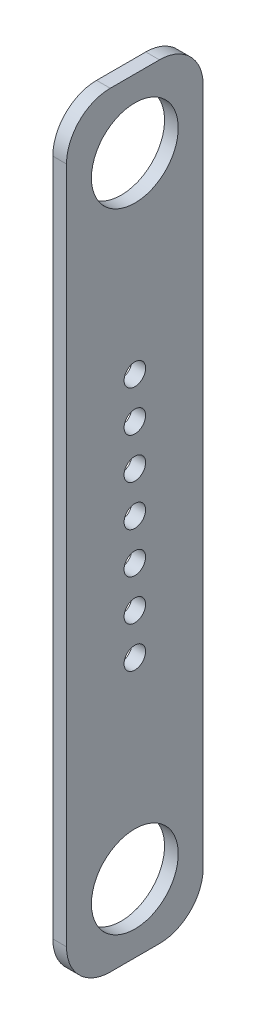
ISO-10303-21;
HEADER;
FILE_DESCRIPTION(('STEP AP214'),'2;1');
FILE_NAME('part.step','',(''),(''),'','','');
FILE_SCHEMA(('AUTOMOTIVE_DESIGN { 1 0 10303 214 1 1 1 1 }'));
ENDSEC;
DATA;
#1=APPLICATION_CONTEXT('core data for automotive mechanical design processes');
#2=APPLICATION_PROTOCOL_DEFINITION('international standard','automotive_design',2000,#1);
#3=PRODUCT_CONTEXT('',#1,'mechanical');
#4=PRODUCT('Part','Part','',(#3));
#5=PRODUCT_RELATED_PRODUCT_CATEGORY('part','',(#4));
#6=PRODUCT_DEFINITION_FORMATION('','',#4);
#7=PRODUCT_DEFINITION_CONTEXT('part definition',#1,'design');
#8=PRODUCT_DEFINITION('design','',#6,#7);
#9=PRODUCT_DEFINITION_SHAPE('','',#8);
#10=(LENGTH_UNIT() NAMED_UNIT(*) SI_UNIT(.MILLI.,.METRE.));
#11=(NAMED_UNIT(*) PLANE_ANGLE_UNIT() SI_UNIT($,.RADIAN.));
#12=(NAMED_UNIT(*) SI_UNIT($,.STERADIAN.) SOLID_ANGLE_UNIT());
#13=UNCERTAINTY_MEASURE_WITH_UNIT(LENGTH_MEASURE(1.E-05),#10,'distance_accuracy_value','');
#14=(GEOMETRIC_REPRESENTATION_CONTEXT(3) GLOBAL_UNCERTAINTY_ASSIGNED_CONTEXT((#13)) GLOBAL_UNIT_ASSIGNED_CONTEXT((#10,
#11,#12)) REPRESENTATION_CONTEXT('',''));
#15=CARTESIAN_POINT('',(0.,0.,0.));
#16=DIRECTION('',(0.,0.,1.));
#17=DIRECTION('',(1.,0.,0.));
#18=AXIS2_PLACEMENT_3D('',#15,#16,#17);
#19=CARTESIAN_POINT('',(0.,0.,0.));
#20=DIRECTION('',(1.,0.,0.));
#21=DIRECTION('',(0.,0.,-1.));
#22=AXIS2_PLACEMENT_3D('',#19,#20,#21);
#23=PLANE('',#22);
#24=CARTESIAN_POINT('',(0.,36.5125,0.));
#25=DIRECTION('',(-1.,0.,0.));
#26=DIRECTION('',(0.,0.,1.));
#27=AXIS2_PLACEMENT_3D('',#24,#25,#26);
#28=CIRCLE('',#27,5.0419);
#29=CARTESIAN_POINT('',(0.,36.5125,5.0419));
#30=VERTEX_POINT('',#29);
#31=EDGE_CURVE('E226',#30,#30,#28,.T.);
#32=ORIENTED_EDGE('',*,*,#31,.T.);
#33=EDGE_LOOP('',(#32));
#34=FACE_BOUND('',#33,.T.);
#35=CARTESIAN_POINT('',(0.,-14.250000075,0.));
#36=DIRECTION('',(-1.,0.,0.));
#37=DIRECTION('',(0.,0.,1.));
#38=AXIS2_PLACEMENT_3D('',#35,#36,#37);
#39=CIRCLE('',#38,1.25);
#40=CARTESIAN_POINT('',(0.,-14.250000075,1.25));
#41=VERTEX_POINT('',#40);
#42=EDGE_CURVE('E214',#41,#41,#39,.T.);
#43=ORIENTED_EDGE('',*,*,#42,.T.);
#44=EDGE_LOOP('',(#43));
#45=FACE_BOUND('',#44,.T.);
#46=DIRECTION('',(0.,0.,1.));
#47=VECTOR('',#46,1.);
#48=CARTESIAN_POINT('',(0.,44.45,-7.93749999999999));
#49=LINE('',#48,#47);
#50=CARTESIAN_POINT('',(0.,44.45,-2.8575));
#51=VERTEX_POINT('',#50);
#52=CARTESIAN_POINT('',(0.,44.45,2.8575));
#53=VERTEX_POINT('',#52);
#54=EDGE_CURVE('E112',#51,#53,#49,.T.);
#55=ORIENTED_EDGE('',*,*,#54,.T.);
#56=CARTESIAN_POINT('',(0.,39.37,2.8575));
#57=DIRECTION('',(1.,0.,0.));
#58=DIRECTION('',(0.,0.,-1.));
#59=AXIS2_PLACEMENT_3D('',#56,#57,#58);
#60=CIRCLE('',#59,5.08);
#61=CARTESIAN_POINT('',(0.,39.37,7.93750000000001));
#62=VERTEX_POINT('',#61);
#63=EDGE_CURVE('E118',#53,#62,#60,.T.);
#64=ORIENTED_EDGE('',*,*,#63,.T.);
#65=DIRECTION('',(0.,-1.,0.));
#66=VECTOR('',#65,1.);
#67=CARTESIAN_POINT('',(0.,44.45,7.93750000000001));
#68=LINE('',#67,#66);
#69=CARTESIAN_POINT('',(0.,-39.37,7.93749999999999));
#70=VERTEX_POINT('',#69);
#71=EDGE_CURVE('E128',#62,#70,#68,.T.);
#72=ORIENTED_EDGE('',*,*,#71,.T.);
#73=CARTESIAN_POINT('',(0.,-39.37,2.8575));
#74=DIRECTION('',(1.,0.,0.));
#75=DIRECTION('',(0.,0.,-1.));
#76=AXIS2_PLACEMENT_3D('',#73,#74,#75);
#77=CIRCLE('',#76,5.08);
#78=CARTESIAN_POINT('',(0.,-44.45,2.8575));
#79=VERTEX_POINT('',#78);
#80=EDGE_CURVE('E119',#70,#79,#77,.T.);
#81=ORIENTED_EDGE('',*,*,#80,.T.);
#82=DIRECTION('',(0.,0.,-1.));
#83=VECTOR('',#82,1.);
#84=CARTESIAN_POINT('',(0.,-44.45,-7.9375));
#85=LINE('',#84,#83);
#86=CARTESIAN_POINT('',(0.,-44.45,-2.8575));
#87=VERTEX_POINT('',#86);
#88=EDGE_CURVE('E164',#79,#87,#85,.T.);
#89=ORIENTED_EDGE('',*,*,#88,.T.);
#90=CARTESIAN_POINT('',(0.,-39.37,-2.8575));
#91=DIRECTION('',(1.,0.,0.));
#92=DIRECTION('',(0.,0.,-1.));
#93=AXIS2_PLACEMENT_3D('',#90,#91,#92);
#94=CIRCLE('',#93,5.08);
#95=CARTESIAN_POINT('',(0.,-39.37,-7.9375));
#96=VERTEX_POINT('',#95);
#97=EDGE_CURVE('E133',#87,#96,#94,.T.);
#98=ORIENTED_EDGE('',*,*,#97,.T.);
#99=DIRECTION('',(0.,1.,0.));
#100=VECTOR('',#99,1.);
#101=CARTESIAN_POINT('',(0.,44.45,-7.93749999999999));
#102=LINE('',#101,#100);
#103=CARTESIAN_POINT('',(0.,39.37,-7.93749999999999));
#104=VERTEX_POINT('',#103);
#105=EDGE_CURVE('E113',#96,#104,#102,.T.);
#106=ORIENTED_EDGE('',*,*,#105,.T.);
#107=CARTESIAN_POINT('',(0.,39.37,-2.8575));
#108=DIRECTION('',(1.,0.,0.));
#109=DIRECTION('',(0.,0.,-1.));
#110=AXIS2_PLACEMENT_3D('',#107,#108,#109);
#111=CIRCLE('',#110,5.08);
#112=EDGE_CURVE('E109',#104,#51,#111,.T.);
#113=ORIENTED_EDGE('',*,*,#112,.T.);
#114=EDGE_LOOP('',(#55,#64,#72,#81,#89,#98,#106,#113));
#115=FACE_BOUND('',#114,.T.);
#116=CARTESIAN_POINT('',(0.,0.,0.));
#117=DIRECTION('',(-1.,0.,0.));
#118=DIRECTION('',(0.,0.,1.));
#119=AXIS2_PLACEMENT_3D('',#116,#117,#118);
#120=CIRCLE('',#119,1.25);
#121=CARTESIAN_POINT('',(0.,0.,1.25));
#122=VERTEX_POINT('',#121);
#123=EDGE_CURVE('E171',#122,#122,#120,.T.);
#124=ORIENTED_EDGE('',*,*,#123,.T.);
#125=EDGE_LOOP('',(#124));
#126=FACE_BOUND('',#125,.T.);
#127=CARTESIAN_POINT('',(0.,4.750000025,0.));
#128=DIRECTION('',(-1.,0.,0.));
#129=DIRECTION('',(0.,0.,1.));
#130=AXIS2_PLACEMENT_3D('',#127,#128,#129);
#131=CIRCLE('',#130,1.25);
#132=CARTESIAN_POINT('',(0.,4.750000025,1.25));
#133=VERTEX_POINT('',#132);
#134=EDGE_CURVE('E184',#133,#133,#131,.T.);
#135=ORIENTED_EDGE('',*,*,#134,.T.);
#136=EDGE_LOOP('',(#135));
#137=FACE_BOUND('',#136,.T.);
#138=CARTESIAN_POINT('',(0.,9.50000005,0.));
#139=DIRECTION('',(-1.,0.,0.));
#140=DIRECTION('',(0.,0.,1.));
#141=AXIS2_PLACEMENT_3D('',#138,#139,#140);
#142=CIRCLE('',#141,1.25);
#143=CARTESIAN_POINT('',(0.,9.50000005,1.25));
#144=VERTEX_POINT('',#143);
#145=EDGE_CURVE('E190',#144,#144,#142,.T.);
#146=ORIENTED_EDGE('',*,*,#145,.T.);
#147=EDGE_LOOP('',(#146));
#148=FACE_BOUND('',#147,.T.);
#149=CARTESIAN_POINT('',(0.,14.250000075,0.));
#150=DIRECTION('',(-1.,0.,0.));
#151=DIRECTION('',(0.,0.,1.));
#152=AXIS2_PLACEMENT_3D('',#149,#150,#151);
#153=CIRCLE('',#152,1.25);
#154=CARTESIAN_POINT('',(0.,14.250000075,1.25));
#155=VERTEX_POINT('',#154);
#156=EDGE_CURVE('E196',#155,#155,#153,.T.);
#157=ORIENTED_EDGE('',*,*,#156,.T.);
#158=EDGE_LOOP('',(#157));
#159=FACE_BOUND('',#158,.T.);
#160=CARTESIAN_POINT('',(0.,-4.750000025,0.));
#161=DIRECTION('',(-1.,0.,0.));
#162=DIRECTION('',(0.,0.,1.));
#163=AXIS2_PLACEMENT_3D('',#160,#161,#162);
#164=CIRCLE('',#163,1.25);
#165=CARTESIAN_POINT('',(0.,-4.750000025,1.25));
#166=VERTEX_POINT('',#165);
#167=EDGE_CURVE('E202',#166,#166,#164,.T.);
#168=ORIENTED_EDGE('',*,*,#167,.T.);
#169=EDGE_LOOP('',(#168));
#170=FACE_BOUND('',#169,.T.);
#171=CARTESIAN_POINT('',(0.,-9.50000005,0.));
#172=DIRECTION('',(-1.,0.,0.));
#173=DIRECTION('',(0.,0.,1.));
#174=AXIS2_PLACEMENT_3D('',#171,#172,#173);
#175=CIRCLE('',#174,1.25);
#176=CARTESIAN_POINT('',(0.,-9.50000005,1.25));
#177=VERTEX_POINT('',#176);
#178=EDGE_CURVE('E208',#177,#177,#175,.T.);
#179=ORIENTED_EDGE('',*,*,#178,.T.);
#180=EDGE_LOOP('',(#179));
#181=FACE_BOUND('',#180,.T.);
#182=CARTESIAN_POINT('',(0.,-36.5125,0.));
#183=DIRECTION('',(-1.,0.,0.));
#184=DIRECTION('',(0.,0.,1.));
#185=AXIS2_PLACEMENT_3D('',#182,#183,#184);
#186=CIRCLE('',#185,5.0419);
#187=CARTESIAN_POINT('',(0.,-36.5125,5.04190000000001));
#188=VERTEX_POINT('',#187);
#189=EDGE_CURVE('E220',#188,#188,#186,.T.);
#190=ORIENTED_EDGE('',*,*,#189,.T.);
#191=EDGE_LOOP('',(#190));
#192=FACE_BOUND('',#191,.T.);
#193=ADVANCED_FACE('F43',(#34,#45,#115,#126,#137,#148,#159,#170,#181,#192),#23,.T.);
#194=CARTESIAN_POINT('',(-1.5875,-44.45,-7.9375));
#195=DIRECTION('',(0.,-1.,0.));
#196=DIRECTION('',(0.,0.,-1.));
#197=AXIS2_PLACEMENT_3D('',#194,#195,#196);
#198=PLANE('',#197);
#199=ORIENTED_EDGE('',*,*,#88,.F.);
#200=DIRECTION('',(1.,0.,0.));
#201=VECTOR('',#200,1.);
#202=CARTESIAN_POINT('',(-1.5875,-44.45,2.8575));
#203=LINE('',#202,#201);
#204=CARTESIAN_POINT('',(-1.5875,-44.45,2.8575));
#205=VERTEX_POINT('',#204);
#206=EDGE_CURVE('E11',#79,#205,#203,.F.);
#207=ORIENTED_EDGE('',*,*,#206,.T.);
#208=DIRECTION('',(0.,0.,-1.));
#209=VECTOR('',#208,1.);
#210=CARTESIAN_POINT('',(-1.5875,-44.45,-7.9375));
#211=LINE('',#210,#209);
#212=CARTESIAN_POINT('',(-1.5875,-44.45,-2.8575));
#213=VERTEX_POINT('',#212);
#214=EDGE_CURVE('E167',#205,#213,#211,.T.);
#215=ORIENTED_EDGE('',*,*,#214,.T.);
#216=DIRECTION('',(1.,0.,0.));
#217=VECTOR('',#216,1.);
#218=CARTESIAN_POINT('',(-1.5875,-44.45,-2.8575));
#219=LINE('',#218,#217);
#220=EDGE_CURVE('E51',#213,#87,#219,.T.);
#221=ORIENTED_EDGE('',*,*,#220,.T.);
#222=EDGE_LOOP('',(#199,#207,#215,#221));
#223=FACE_BOUND('',#222,.T.);
#224=ADVANCED_FACE('F163',(#223),#198,.T.);
#225=CARTESIAN_POINT('',(-1.5875,44.45,7.93750000000001));
#226=DIRECTION('',(0.,0.,1.));
#227=DIRECTION('',(0.,-1.,0.));
#228=AXIS2_PLACEMENT_3D('',#225,#226,#227);
#229=PLANE('',#228);
#230=ORIENTED_EDGE('',*,*,#71,.F.);
#231=DIRECTION('',(1.,0.,0.));
#232=VECTOR('',#231,1.);
#233=CARTESIAN_POINT('',(-1.5875,39.37,7.93750000000001));
#234=LINE('',#233,#232);
#235=CARTESIAN_POINT('',(-1.5875,39.37,7.93750000000001));
#236=VERTEX_POINT('',#235);
#237=EDGE_CURVE('E146',#62,#236,#234,.F.);
#238=ORIENTED_EDGE('',*,*,#237,.T.);
#239=DIRECTION('',(0.,-1.,0.));
#240=VECTOR('',#239,1.);
#241=CARTESIAN_POINT('',(-1.5875,44.45,7.93750000000001));
#242=LINE('',#241,#240);
#243=CARTESIAN_POINT('',(-1.5875,-39.37,7.93749999999999));
#244=VERTEX_POINT('',#243);
#245=EDGE_CURVE('E131',#236,#244,#242,.T.);
#246=ORIENTED_EDGE('',*,*,#245,.T.);
#247=DIRECTION('',(1.,0.,0.));
#248=VECTOR('',#247,1.);
#249=CARTESIAN_POINT('',(-1.5875,-39.37,7.93749999999999));
#250=LINE('',#249,#248);
#251=EDGE_CURVE('E143',#244,#70,#250,.T.);
#252=ORIENTED_EDGE('',*,*,#251,.T.);
#253=EDGE_LOOP('',(#230,#238,#246,#252));
#254=FACE_BOUND('',#253,.T.);
#255=ADVANCED_FACE('F265',(#254),#229,.T.);
#256=CARTESIAN_POINT('',(-1.5875,44.45,-7.93749999999999));
#257=DIRECTION('',(0.,1.,0.));
#258=DIRECTION('',(0.,0.,1.));
#259=AXIS2_PLACEMENT_3D('',#256,#257,#258);
#260=PLANE('',#259);
#261=DIRECTION('',(0.,0.,1.));
#262=VECTOR('',#261,1.);
#263=CARTESIAN_POINT('',(-1.5875,44.45,-7.93749999999999));
#264=LINE('',#263,#262);
#265=CARTESIAN_POINT('',(-1.5875,44.45,-2.8575));
#266=VERTEX_POINT('',#265);
#267=CARTESIAN_POINT('',(-1.5875,44.45,2.8575));
#268=VERTEX_POINT('',#267);
#269=EDGE_CURVE('E136',#266,#268,#264,.T.);
#270=ORIENTED_EDGE('',*,*,#269,.T.);
#271=DIRECTION('',(1.,0.,0.));
#272=VECTOR('',#271,1.);
#273=CARTESIAN_POINT('',(-1.5875,44.45,2.8575));
#274=LINE('',#273,#272);
#275=EDGE_CURVE('E127',#268,#53,#274,.T.);
#276=ORIENTED_EDGE('',*,*,#275,.T.);
#277=ORIENTED_EDGE('',*,*,#54,.F.);
#278=DIRECTION('',(1.,0.,0.));
#279=VECTOR('',#278,1.);
#280=CARTESIAN_POINT('',(-1.5875,44.45,-2.8575));
#281=LINE('',#280,#279);
#282=EDGE_CURVE('E125',#51,#266,#281,.F.);
#283=ORIENTED_EDGE('',*,*,#282,.T.);
#284=EDGE_LOOP('',(#270,#276,#277,#283));
#285=FACE_BOUND('',#284,.T.);
#286=ADVANCED_FACE('F124',(#285),#260,.T.);
#287=CARTESIAN_POINT('',(-1.5875,44.45,-7.93749999999999));
#288=DIRECTION('',(0.,0.,-1.));
#289=DIRECTION('',(0.,1.,0.));
#290=AXIS2_PLACEMENT_3D('',#287,#288,#289);
#291=PLANE('',#290);
#292=DIRECTION('',(0.,1.,0.));
#293=VECTOR('',#292,1.);
#294=CARTESIAN_POINT('',(-1.5875,44.45,-7.93749999999999));
#295=LINE('',#294,#293);
#296=CARTESIAN_POINT('',(-1.5875,-39.37,-7.9375));
#297=VERTEX_POINT('',#296);
#298=CARTESIAN_POINT('',(-1.5875,39.37,-7.93749999999999));
#299=VERTEX_POINT('',#298);
#300=EDGE_CURVE('E179',#297,#299,#295,.T.);
#301=ORIENTED_EDGE('',*,*,#300,.T.);
#302=DIRECTION('',(1.,0.,0.));
#303=VECTOR('',#302,1.);
#304=CARTESIAN_POINT('',(-1.5875,39.37,-7.93749999999999));
#305=LINE('',#304,#303);
#306=EDGE_CURVE('E156',#299,#104,#305,.T.);
#307=ORIENTED_EDGE('',*,*,#306,.T.);
#308=ORIENTED_EDGE('',*,*,#105,.F.);
#309=DIRECTION('',(1.,0.,0.));
#310=VECTOR('',#309,1.);
#311=CARTESIAN_POINT('',(-1.5875,-39.37,-7.9375));
#312=LINE('',#311,#310);
#313=EDGE_CURVE('E65',#96,#297,#312,.F.);
#314=ORIENTED_EDGE('',*,*,#313,.T.);
#315=EDGE_LOOP('',(#301,#307,#308,#314));
#316=FACE_BOUND('',#315,.T.);
#317=ADVANCED_FACE('F239',(#316),#291,.T.);
#318=CARTESIAN_POINT('',(-1.5875,0.,0.));
#319=DIRECTION('',(1.,0.,0.));
#320=DIRECTION('',(0.,0.,-1.));
#321=AXIS2_PLACEMENT_3D('',#318,#319,#320);
#322=PLANE('',#321);
#323=CARTESIAN_POINT('',(-1.5875,36.5125,0.));
#324=DIRECTION('',(-1.,0.,0.));
#325=DIRECTION('',(0.,0.,1.));
#326=AXIS2_PLACEMENT_3D('',#323,#324,#325);
#327=CIRCLE('',#326,5.0419);
#328=CARTESIAN_POINT('',(-1.5875,36.5125,5.0419));
#329=VERTEX_POINT('',#328);
#330=EDGE_CURVE('E229',#329,#329,#327,.T.);
#331=ORIENTED_EDGE('',*,*,#330,.F.);
#332=EDGE_LOOP('',(#331));
#333=FACE_BOUND('',#332,.T.);
#334=CARTESIAN_POINT('',(-1.5875,-36.5125,0.));
#335=DIRECTION('',(-1.,0.,0.));
#336=DIRECTION('',(0.,0.,1.));
#337=AXIS2_PLACEMENT_3D('',#334,#335,#336);
#338=CIRCLE('',#337,5.0419);
#339=CARTESIAN_POINT('',(-1.5875,-36.5125,5.04190000000001));
#340=VERTEX_POINT('',#339);
#341=EDGE_CURVE('E223',#340,#340,#338,.T.);
#342=ORIENTED_EDGE('',*,*,#341,.F.);
#343=EDGE_LOOP('',(#342));
#344=FACE_BOUND('',#343,.T.);
#345=CARTESIAN_POINT('',(-1.5875,-14.250000075,0.));
#346=DIRECTION('',(-1.,0.,0.));
#347=DIRECTION('',(0.,0.,1.));
#348=AXIS2_PLACEMENT_3D('',#345,#346,#347);
#349=CIRCLE('',#348,1.25);
#350=CARTESIAN_POINT('',(-1.5875,-14.250000075,1.25));
#351=VERTEX_POINT('',#350);
#352=EDGE_CURVE('E217',#351,#351,#349,.T.);
#353=ORIENTED_EDGE('',*,*,#352,.F.);
#354=EDGE_LOOP('',(#353));
#355=FACE_BOUND('',#354,.T.);
#356=CARTESIAN_POINT('',(-1.5875,-9.50000005,0.));
#357=DIRECTION('',(-1.,0.,0.));
#358=DIRECTION('',(0.,0.,1.));
#359=AXIS2_PLACEMENT_3D('',#356,#357,#358);
#360=CIRCLE('',#359,1.25);
#361=CARTESIAN_POINT('',(-1.5875,-9.50000005,1.25));
#362=VERTEX_POINT('',#361);
#363=EDGE_CURVE('E211',#362,#362,#360,.T.);
#364=ORIENTED_EDGE('',*,*,#363,.F.);
#365=EDGE_LOOP('',(#364));
#366=FACE_BOUND('',#365,.T.);
#367=CARTESIAN_POINT('',(-1.5875,-4.750000025,0.));
#368=DIRECTION('',(-1.,0.,0.));
#369=DIRECTION('',(0.,0.,1.));
#370=AXIS2_PLACEMENT_3D('',#367,#368,#369);
#371=CIRCLE('',#370,1.25);
#372=CARTESIAN_POINT('',(-1.5875,-4.750000025,1.25));
#373=VERTEX_POINT('',#372);
#374=EDGE_CURVE('E205',#373,#373,#371,.T.);
#375=ORIENTED_EDGE('',*,*,#374,.F.);
#376=EDGE_LOOP('',(#375));
#377=FACE_BOUND('',#376,.T.);
#378=CARTESIAN_POINT('',(-1.5875,14.250000075,0.));
#379=DIRECTION('',(-1.,0.,0.));
#380=DIRECTION('',(0.,0.,1.));
#381=AXIS2_PLACEMENT_3D('',#378,#379,#380);
#382=CIRCLE('',#381,1.25);
#383=CARTESIAN_POINT('',(-1.5875,14.250000075,1.25));
#384=VERTEX_POINT('',#383);
#385=EDGE_CURVE('E199',#384,#384,#382,.T.);
#386=ORIENTED_EDGE('',*,*,#385,.F.);
#387=EDGE_LOOP('',(#386));
#388=FACE_BOUND('',#387,.T.);
#389=CARTESIAN_POINT('',(-1.5875,9.50000005,0.));
#390=DIRECTION('',(-1.,0.,0.));
#391=DIRECTION('',(0.,0.,1.));
#392=AXIS2_PLACEMENT_3D('',#389,#390,#391);
#393=CIRCLE('',#392,1.25);
#394=CARTESIAN_POINT('',(-1.5875,9.50000005,1.25));
#395=VERTEX_POINT('',#394);
#396=EDGE_CURVE('E193',#395,#395,#393,.T.);
#397=ORIENTED_EDGE('',*,*,#396,.F.);
#398=EDGE_LOOP('',(#397));
#399=FACE_BOUND('',#398,.T.);
#400=CARTESIAN_POINT('',(-1.5875,4.750000025,0.));
#401=DIRECTION('',(-1.,0.,0.));
#402=DIRECTION('',(0.,0.,1.));
#403=AXIS2_PLACEMENT_3D('',#400,#401,#402);
#404=CIRCLE('',#403,1.25);
#405=CARTESIAN_POINT('',(-1.5875,4.750000025,1.25));
#406=VERTEX_POINT('',#405);
#407=EDGE_CURVE('E187',#406,#406,#404,.T.);
#408=ORIENTED_EDGE('',*,*,#407,.F.);
#409=EDGE_LOOP('',(#408));
#410=FACE_BOUND('',#409,.T.);
#411=CARTESIAN_POINT('',(-1.5875,0.,0.));
#412=DIRECTION('',(-1.,0.,0.));
#413=DIRECTION('',(0.,0.,1.));
#414=AXIS2_PLACEMENT_3D('',#411,#412,#413);
#415=CIRCLE('',#414,1.25);
#416=CARTESIAN_POINT('',(-1.5875,0.,1.25));
#417=VERTEX_POINT('',#416);
#418=EDGE_CURVE('E175',#417,#417,#415,.T.);
#419=ORIENTED_EDGE('',*,*,#418,.F.);
#420=EDGE_LOOP('',(#419));
#421=FACE_BOUND('',#420,.T.);
#422=ORIENTED_EDGE('',*,*,#245,.F.);
#423=CARTESIAN_POINT('',(-1.5875,39.37,2.8575));
#424=DIRECTION('',(1.,0.,0.));
#425=DIRECTION('',(0.,0.,-1.));
#426=AXIS2_PLACEMENT_3D('',#423,#424,#425);
#427=CIRCLE('',#426,5.08);
#428=EDGE_CURVE('E153',#236,#268,#427,.F.);
#429=ORIENTED_EDGE('',*,*,#428,.T.);
#430=ORIENTED_EDGE('',*,*,#269,.F.);
#431=CARTESIAN_POINT('',(-1.5875,39.37,-2.8575));
#432=DIRECTION('',(1.,0.,0.));
#433=DIRECTION('',(0.,0.,-1.));
#434=AXIS2_PLACEMENT_3D('',#431,#432,#433);
#435=CIRCLE('',#434,5.08);
#436=EDGE_CURVE('E58',#266,#299,#435,.F.);
#437=ORIENTED_EDGE('',*,*,#436,.T.);
#438=ORIENTED_EDGE('',*,*,#300,.F.);
#439=CARTESIAN_POINT('',(-1.5875,-39.37,-2.8575));
#440=DIRECTION('',(1.,0.,0.));
#441=DIRECTION('',(0.,0.,-1.));
#442=AXIS2_PLACEMENT_3D('',#439,#440,#441);
#443=CIRCLE('',#442,5.08);
#444=EDGE_CURVE('E148',#297,#213,#443,.F.);
#445=ORIENTED_EDGE('',*,*,#444,.T.);
#446=ORIENTED_EDGE('',*,*,#214,.F.);
#447=CARTESIAN_POINT('',(-1.5875,-39.37,2.8575));
#448=DIRECTION('',(1.,0.,0.));
#449=DIRECTION('',(0.,0.,-1.));
#450=AXIS2_PLACEMENT_3D('',#447,#448,#449);
#451=CIRCLE('',#450,5.08);
#452=EDGE_CURVE('E150',#205,#244,#451,.F.);
#453=ORIENTED_EDGE('',*,*,#452,.T.);
#454=EDGE_LOOP('',(#422,#429,#430,#437,#438,#445,#446,#453));
#455=FACE_BOUND('',#454,.T.);
#456=ADVANCED_FACE('F235',(#333,#344,#355,#366,#377,#388,#399,#410,#421,#455),#322,.F.);
#457=CARTESIAN_POINT('',(-1.5875,0.,0.));
#458=DIRECTION('',(-1.,0.,0.));
#459=DIRECTION('',(0.,0.,1.));
#460=AXIS2_PLACEMENT_3D('',#457,#458,#459);
#461=CYLINDRICAL_SURFACE('',#460,1.25);
#462=ORIENTED_EDGE('',*,*,#123,.F.);
#463=EDGE_LOOP('',(#462));
#464=FACE_BOUND('',#463,.T.);
#465=ORIENTED_EDGE('',*,*,#418,.T.);
#466=EDGE_LOOP('',(#465));
#467=FACE_BOUND('',#466,.T.);
#468=ADVANCED_FACE('F238',(#464,#467),#461,.F.);
#469=CARTESIAN_POINT('',(-1.5875,4.750000025,0.));
#470=DIRECTION('',(-1.,0.,0.));
#471=DIRECTION('',(0.,0.,1.));
#472=AXIS2_PLACEMENT_3D('',#469,#470,#471);
#473=CYLINDRICAL_SURFACE('',#472,1.25);
#474=ORIENTED_EDGE('',*,*,#134,.F.);
#475=EDGE_LOOP('',(#474));
#476=FACE_BOUND('',#475,.T.);
#477=ORIENTED_EDGE('',*,*,#407,.T.);
#478=EDGE_LOOP('',(#477));
#479=FACE_BOUND('',#478,.T.);
#480=ADVANCED_FACE('F353',(#476,#479),#473,.F.);
#481=CARTESIAN_POINT('',(-1.5875,9.50000005,0.));
#482=DIRECTION('',(-1.,0.,0.));
#483=DIRECTION('',(0.,0.,1.));
#484=AXIS2_PLACEMENT_3D('',#481,#482,#483);
#485=CYLINDRICAL_SURFACE('',#484,1.25);
#486=ORIENTED_EDGE('',*,*,#145,.F.);
#487=EDGE_LOOP('',(#486));
#488=FACE_BOUND('',#487,.T.);
#489=ORIENTED_EDGE('',*,*,#396,.T.);
#490=EDGE_LOOP('',(#489));
#491=FACE_BOUND('',#490,.T.);
#492=ADVANCED_FACE('F349',(#488,#491),#485,.F.);
#493=CARTESIAN_POINT('',(-1.5875,14.250000075,0.));
#494=DIRECTION('',(-1.,0.,0.));
#495=DIRECTION('',(0.,0.,1.));
#496=AXIS2_PLACEMENT_3D('',#493,#494,#495);
#497=CYLINDRICAL_SURFACE('',#496,1.25);
#498=ORIENTED_EDGE('',*,*,#156,.F.);
#499=EDGE_LOOP('',(#498));
#500=FACE_BOUND('',#499,.T.);
#501=ORIENTED_EDGE('',*,*,#385,.T.);
#502=EDGE_LOOP('',(#501));
#503=FACE_BOUND('',#502,.T.);
#504=ADVANCED_FACE('F345',(#500,#503),#497,.F.);
#505=CARTESIAN_POINT('',(-1.5875,-4.750000025,0.));
#506=DIRECTION('',(-1.,0.,0.));
#507=DIRECTION('',(0.,0.,1.));
#508=AXIS2_PLACEMENT_3D('',#505,#506,#507);
#509=CYLINDRICAL_SURFACE('',#508,1.25);
#510=ORIENTED_EDGE('',*,*,#167,.F.);
#511=EDGE_LOOP('',(#510));
#512=FACE_BOUND('',#511,.T.);
#513=ORIENTED_EDGE('',*,*,#374,.T.);
#514=EDGE_LOOP('',(#513));
#515=FACE_BOUND('',#514,.T.);
#516=ADVANCED_FACE('F341',(#512,#515),#509,.F.);
#517=CARTESIAN_POINT('',(-1.5875,-9.50000005,0.));
#518=DIRECTION('',(-1.,0.,0.));
#519=DIRECTION('',(0.,0.,1.));
#520=AXIS2_PLACEMENT_3D('',#517,#518,#519);
#521=CYLINDRICAL_SURFACE('',#520,1.25);
#522=ORIENTED_EDGE('',*,*,#178,.F.);
#523=EDGE_LOOP('',(#522));
#524=FACE_BOUND('',#523,.T.);
#525=ORIENTED_EDGE('',*,*,#363,.T.);
#526=EDGE_LOOP('',(#525));
#527=FACE_BOUND('',#526,.T.);
#528=ADVANCED_FACE('F337',(#524,#527),#521,.F.);
#529=CARTESIAN_POINT('',(-1.5875,-14.250000075,0.));
#530=DIRECTION('',(-1.,0.,0.));
#531=DIRECTION('',(0.,0.,1.));
#532=AXIS2_PLACEMENT_3D('',#529,#530,#531);
#533=CYLINDRICAL_SURFACE('',#532,1.25);
#534=ORIENTED_EDGE('',*,*,#42,.F.);
#535=EDGE_LOOP('',(#534));
#536=FACE_BOUND('',#535,.T.);
#537=ORIENTED_EDGE('',*,*,#352,.T.);
#538=EDGE_LOOP('',(#537));
#539=FACE_BOUND('',#538,.T.);
#540=ADVANCED_FACE('F294',(#536,#539),#533,.F.);
#541=CARTESIAN_POINT('',(-1.5875,39.37,2.8575));
#542=DIRECTION('',(1.,0.,0.));
#543=DIRECTION('',(0.,0.,-1.));
#544=AXIS2_PLACEMENT_3D('',#541,#542,#543);
#545=CYLINDRICAL_SURFACE('',#544,5.08);
#546=ORIENTED_EDGE('',*,*,#428,.F.);
#547=ORIENTED_EDGE('',*,*,#237,.F.);
#548=ORIENTED_EDGE('',*,*,#63,.F.);
#549=ORIENTED_EDGE('',*,*,#275,.F.);
#550=EDGE_LOOP('',(#546,#547,#548,#549));
#551=FACE_BOUND('',#550,.T.);
#552=ADVANCED_FACE('F263',(#551),#545,.T.);
#553=CARTESIAN_POINT('',(-1.5875,39.37,-2.8575));
#554=DIRECTION('',(1.,0.,0.));
#555=DIRECTION('',(0.,0.,-1.));
#556=AXIS2_PLACEMENT_3D('',#553,#554,#555);
#557=CYLINDRICAL_SURFACE('',#556,5.08);
#558=ORIENTED_EDGE('',*,*,#436,.F.);
#559=ORIENTED_EDGE('',*,*,#282,.F.);
#560=ORIENTED_EDGE('',*,*,#112,.F.);
#561=ORIENTED_EDGE('',*,*,#306,.F.);
#562=EDGE_LOOP('',(#558,#559,#560,#561));
#563=FACE_BOUND('',#562,.T.);
#564=ADVANCED_FACE('F130',(#563),#557,.T.);
#565=CARTESIAN_POINT('',(-1.5875,-39.37,2.8575));
#566=DIRECTION('',(1.,0.,0.));
#567=DIRECTION('',(0.,0.,-1.));
#568=AXIS2_PLACEMENT_3D('',#565,#566,#567);
#569=CYLINDRICAL_SURFACE('',#568,5.08);
#570=ORIENTED_EDGE('',*,*,#452,.F.);
#571=ORIENTED_EDGE('',*,*,#206,.F.);
#572=ORIENTED_EDGE('',*,*,#80,.F.);
#573=ORIENTED_EDGE('',*,*,#251,.F.);
#574=EDGE_LOOP('',(#570,#571,#572,#573));
#575=FACE_BOUND('',#574,.T.);
#576=ADVANCED_FACE('F267',(#575),#569,.T.);
#577=CARTESIAN_POINT('',(-1.5875,-39.37,-2.8575));
#578=DIRECTION('',(1.,0.,0.));
#579=DIRECTION('',(0.,0.,-1.));
#580=AXIS2_PLACEMENT_3D('',#577,#578,#579);
#581=CYLINDRICAL_SURFACE('',#580,5.08);
#582=ORIENTED_EDGE('',*,*,#444,.F.);
#583=ORIENTED_EDGE('',*,*,#313,.F.);
#584=ORIENTED_EDGE('',*,*,#97,.F.);
#585=ORIENTED_EDGE('',*,*,#220,.F.);
#586=EDGE_LOOP('',(#582,#583,#584,#585));
#587=FACE_BOUND('',#586,.T.);
#588=ADVANCED_FACE('F45',(#587),#581,.T.);
#589=CARTESIAN_POINT('',(-1.5875,-36.5125,0.));
#590=DIRECTION('',(-1.,0.,0.));
#591=DIRECTION('',(0.,0.,1.));
#592=AXIS2_PLACEMENT_3D('',#589,#590,#591);
#593=CYLINDRICAL_SURFACE('',#592,5.0419);
#594=ORIENTED_EDGE('',*,*,#189,.F.);
#595=EDGE_LOOP('',(#594));
#596=FACE_BOUND('',#595,.T.);
#597=ORIENTED_EDGE('',*,*,#341,.T.);
#598=EDGE_LOOP('',(#597));
#599=FACE_BOUND('',#598,.T.);
#600=ADVANCED_FACE('F269',(#596,#599),#593,.F.);
#601=CARTESIAN_POINT('',(-1.5875,36.5125,0.));
#602=DIRECTION('',(-1.,0.,0.));
#603=DIRECTION('',(0.,0.,1.));
#604=AXIS2_PLACEMENT_3D('',#601,#602,#603);
#605=CYLINDRICAL_SURFACE('',#604,5.0419);
#606=ORIENTED_EDGE('',*,*,#31,.F.);
#607=EDGE_LOOP('',(#606));
#608=FACE_BOUND('',#607,.T.);
#609=ORIENTED_EDGE('',*,*,#330,.T.);
#610=EDGE_LOOP('',(#609));
#611=FACE_BOUND('',#610,.T.);
#612=ADVANCED_FACE('F233',(#608,#611),#605,.F.);
#613=CLOSED_SHELL('',(#193,#224,#255,#286,#317,#456,#468,#480,#492,#504,#516,#528,#540,#552,
#564,#576,#588,#600,#612));
#614=MANIFOLD_SOLID_BREP('B2',#613);
#615=ADVANCED_BREP_SHAPE_REPRESENTATION('',(#18,#614),#14);
#616=SHAPE_DEFINITION_REPRESENTATION(#9,#615);
ENDSEC;
END-ISO-10303-21;
